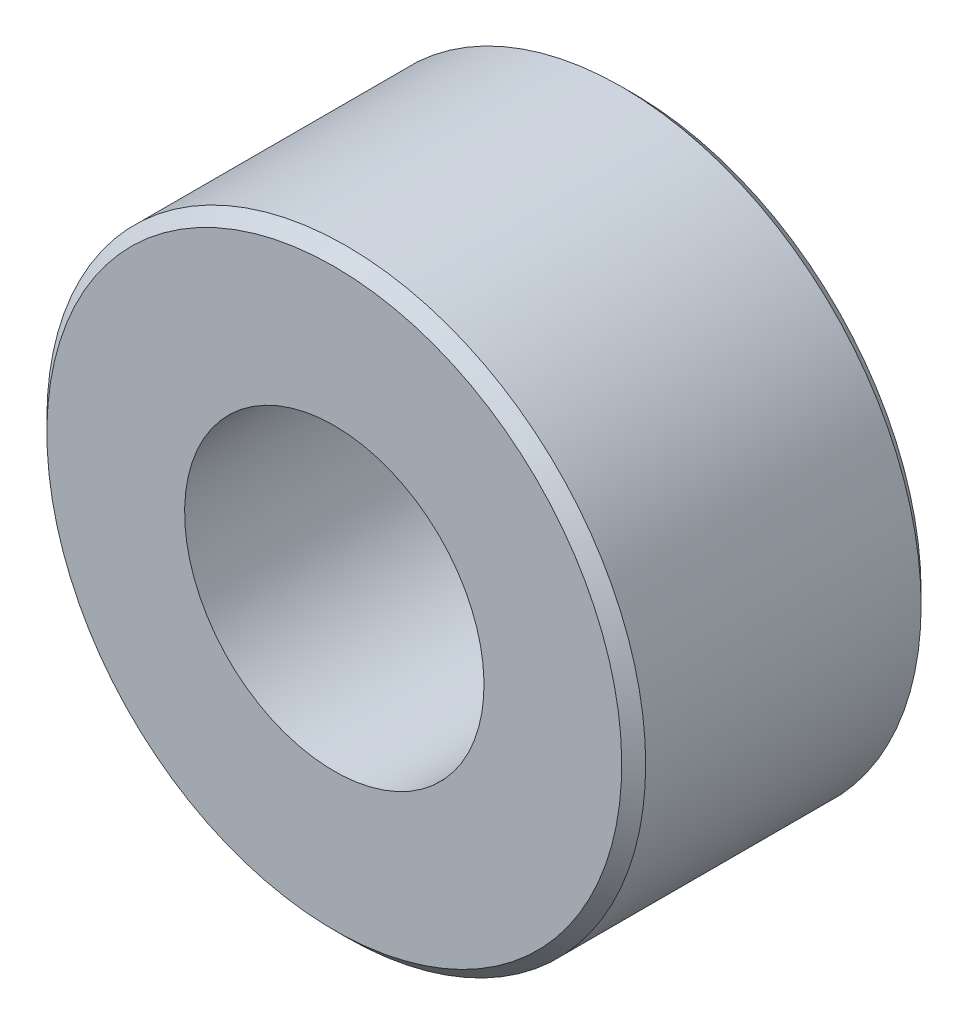
ISO-10303-21;
HEADER;
FILE_DESCRIPTION(('STEP AP214'),'2;1');
FILE_NAME('part.step','',(''),(''),'','','');
FILE_SCHEMA(('AUTOMOTIVE_DESIGN { 1 0 10303 214 1 1 1 1 }'));
ENDSEC;
DATA;
#1=APPLICATION_CONTEXT('core data for automotive mechanical design processes');
#2=APPLICATION_PROTOCOL_DEFINITION('international standard','automotive_design',2000,#1);
#3=PRODUCT_CONTEXT('',#1,'mechanical');
#4=PRODUCT('Part','Part','',(#3));
#5=PRODUCT_RELATED_PRODUCT_CATEGORY('part','',(#4));
#6=PRODUCT_DEFINITION_FORMATION('','',#4);
#7=PRODUCT_DEFINITION_CONTEXT('part definition',#1,'design');
#8=PRODUCT_DEFINITION('design','',#6,#7);
#9=PRODUCT_DEFINITION_SHAPE('','',#8);
#10=(LENGTH_UNIT() NAMED_UNIT(*) SI_UNIT(.MILLI.,.METRE.));
#11=(NAMED_UNIT(*) PLANE_ANGLE_UNIT() SI_UNIT($,.RADIAN.));
#12=(NAMED_UNIT(*) SI_UNIT($,.STERADIAN.) SOLID_ANGLE_UNIT());
#13=UNCERTAINTY_MEASURE_WITH_UNIT(LENGTH_MEASURE(1.E-05),#10,'distance_accuracy_value','');
#14=(GEOMETRIC_REPRESENTATION_CONTEXT(3) GLOBAL_UNCERTAINTY_ASSIGNED_CONTEXT((#13)) GLOBAL_UNIT_ASSIGNED_CONTEXT((#10,
#11,#12)) REPRESENTATION_CONTEXT('',''));
#15=CARTESIAN_POINT('',(0.,0.,0.));
#16=DIRECTION('',(0.,0.,1.));
#17=DIRECTION('',(1.,0.,0.));
#18=AXIS2_PLACEMENT_3D('',#15,#16,#17);
#19=CARTESIAN_POINT('',(-4.8576,-4.8576,0.));
#20=DIRECTION('',(0.,0.,1.));
#21=DIRECTION('',(1.,0.,0.));
#22=AXIS2_PLACEMENT_3D('',#19,#20,#21);
#23=PLANE('',#22);
#24=CARTESIAN_POINT('',(0.,0.,0.));
#25=DIRECTION('',(0.,0.,-1.));
#26=DIRECTION('',(0.,1.,0.));
#27=AXIS2_PLACEMENT_3D('',#24,#25,#26);
#28=CIRCLE('',#27,2.5);
#29=CARTESIAN_POINT('',(0.,2.5,0.));
#30=VERTEX_POINT('',#29);
#31=EDGE_CURVE('E33',#30,#30,#28,.T.);
#32=ORIENTED_EDGE('',*,*,#31,.F.);
#33=EDGE_LOOP('',(#32));
#34=FACE_BOUND('',#33,.T.);
#35=CARTESIAN_POINT('',(0.,0.,0.));
#36=DIRECTION('',(0.,0.,1.));
#37=DIRECTION('',(1.,0.,0.));
#38=AXIS2_PLACEMENT_3D('',#35,#36,#37);
#39=CIRCLE('',#38,4.8);
#40=CARTESIAN_POINT('',(4.8,0.,0.));
#41=VERTEX_POINT('',#40);
#42=EDGE_CURVE('E18',#41,#41,#39,.F.);
#43=ORIENTED_EDGE('',*,*,#42,.T.);
#44=EDGE_LOOP('',(#43));
#45=FACE_BOUND('',#44,.T.);
#46=ADVANCED_FACE('F14',(#34,#45),#23,.F.);
#47=CARTESIAN_POINT('',(0.,0.,0.));
#48=DIRECTION('',(0.,0.,1.));
#49=DIRECTION('',(1.,0.,0.));
#50=AXIS2_PLACEMENT_3D('',#47,#48,#49);
#51=CONICAL_SURFACE('',#50,4.8,0.78539816339745);
#52=CARTESIAN_POINT('',(0.,0.,0.2));
#53=DIRECTION('',(0.,0.,-1.));
#54=DIRECTION('',(-1.,0.,0.));
#55=AXIS2_PLACEMENT_3D('',#52,#53,#54);
#56=CIRCLE('',#55,5.);
#57=CARTESIAN_POINT('',(-5.,0.,0.2));
#58=VERTEX_POINT('',#57);
#59=EDGE_CURVE('E31',#58,#58,#56,.T.);
#60=ORIENTED_EDGE('',*,*,#59,.T.);
#61=EDGE_LOOP('',(#60));
#62=FACE_BOUND('',#61,.T.);
#63=ORIENTED_EDGE('',*,*,#42,.F.);
#64=EDGE_LOOP('',(#63));
#65=FACE_BOUND('',#64,.T.);
#66=ADVANCED_FACE('F42',(#62,#65),#51,.T.);
#67=CARTESIAN_POINT('',(0.,0.,5.));
#68=DIRECTION('',(0.,0.,-1.));
#69=DIRECTION('',(0.,1.,0.));
#70=AXIS2_PLACEMENT_3D('',#67,#68,#69);
#71=CYLINDRICAL_SURFACE('',#70,2.5);
#72=CARTESIAN_POINT('',(0.,0.,5.));
#73=DIRECTION('',(0.,0.,-1.));
#74=DIRECTION('',(0.,1.,0.));
#75=AXIS2_PLACEMENT_3D('',#72,#73,#74);
#76=CIRCLE('',#75,2.5);
#77=CARTESIAN_POINT('',(0.,2.5,5.));
#78=VERTEX_POINT('',#77);
#79=EDGE_CURVE('E27',#78,#78,#76,.T.);
#80=ORIENTED_EDGE('',*,*,#79,.F.);
#81=EDGE_LOOP('',(#80));
#82=FACE_BOUND('',#81,.T.);
#83=ORIENTED_EDGE('',*,*,#31,.T.);
#84=EDGE_LOOP('',(#83));
#85=FACE_BOUND('',#84,.T.);
#86=ADVANCED_FACE('F44',(#82,#85),#71,.F.);
#87=CARTESIAN_POINT('',(0.,0.,4.8));
#88=DIRECTION('',(0.,0.,-1.));
#89=DIRECTION('',(-1.,0.,0.));
#90=AXIS2_PLACEMENT_3D('',#87,#88,#89);
#91=CYLINDRICAL_SURFACE('',#90,5.);
#92=ORIENTED_EDGE('',*,*,#59,.F.);
#93=EDGE_LOOP('',(#92));
#94=FACE_BOUND('',#93,.T.);
#95=CARTESIAN_POINT('',(0.,0.,4.79999999999992));
#96=DIRECTION('',(0.,0.,-1.));
#97=DIRECTION('',(-1.,0.,0.));
#98=AXIS2_PLACEMENT_3D('',#95,#96,#97);
#99=CIRCLE('',#98,5.);
#100=CARTESIAN_POINT('',(-5.,0.,4.8));
#101=VERTEX_POINT('',#100);
#102=EDGE_CURVE('E22',#101,#101,#99,.T.);
#103=ORIENTED_EDGE('',*,*,#102,.T.);
#104=EDGE_LOOP('',(#103));
#105=FACE_BOUND('',#104,.T.);
#106=ADVANCED_FACE('F52',(#94,#105),#91,.T.);
#107=CARTESIAN_POINT('',(-4.8576,-4.8576,5.));
#108=DIRECTION('',(0.,0.,1.));
#109=DIRECTION('',(1.,0.,0.));
#110=AXIS2_PLACEMENT_3D('',#107,#108,#109);
#111=PLANE('',#110);
#112=ORIENTED_EDGE('',*,*,#79,.T.);
#113=EDGE_LOOP('',(#112));
#114=FACE_BOUND('',#113,.T.);
#115=CARTESIAN_POINT('',(0.,0.,4.99999999999989));
#116=DIRECTION('',(0.,0.,-1.));
#117=DIRECTION('',(0.,1.,0.));
#118=AXIS2_PLACEMENT_3D('',#115,#116,#117);
#119=CIRCLE('',#118,4.80000000000011);
#120=CARTESIAN_POINT('',(0.,4.80000000000011,4.99999999999989));
#121=VERTEX_POINT('',#120);
#122=EDGE_CURVE('E10',#121,#121,#119,.F.);
#123=ORIENTED_EDGE('',*,*,#122,.T.);
#124=EDGE_LOOP('',(#123));
#125=FACE_BOUND('',#124,.T.);
#126=ADVANCED_FACE('F16',(#114,#125),#111,.T.);
#127=CARTESIAN_POINT('',(0.,0.,5.));
#128=DIRECTION('',(0.,0.,-1.));
#129=DIRECTION('',(0.,1.,0.));
#130=AXIS2_PLACEMENT_3D('',#127,#128,#129);
#131=CONICAL_SURFACE('',#130,4.8,0.785398163397448);
#132=ORIENTED_EDGE('',*,*,#122,.F.);
#133=EDGE_LOOP('',(#132));
#134=FACE_BOUND('',#133,.T.);
#135=ORIENTED_EDGE('',*,*,#102,.F.);
#136=EDGE_LOOP('',(#135));
#137=FACE_BOUND('',#136,.T.);
#138=ADVANCED_FACE('F56',(#134,#137),#131,.T.);
#139=CLOSED_SHELL('',(#46,#66,#86,#106,#126,#138));
#140=MANIFOLD_SOLID_BREP('B1',#139);
#141=ADVANCED_BREP_SHAPE_REPRESENTATION('',(#18,#140),#14);
#142=SHAPE_DEFINITION_REPRESENTATION(#9,#141);
ENDSEC;
END-ISO-10303-21;
